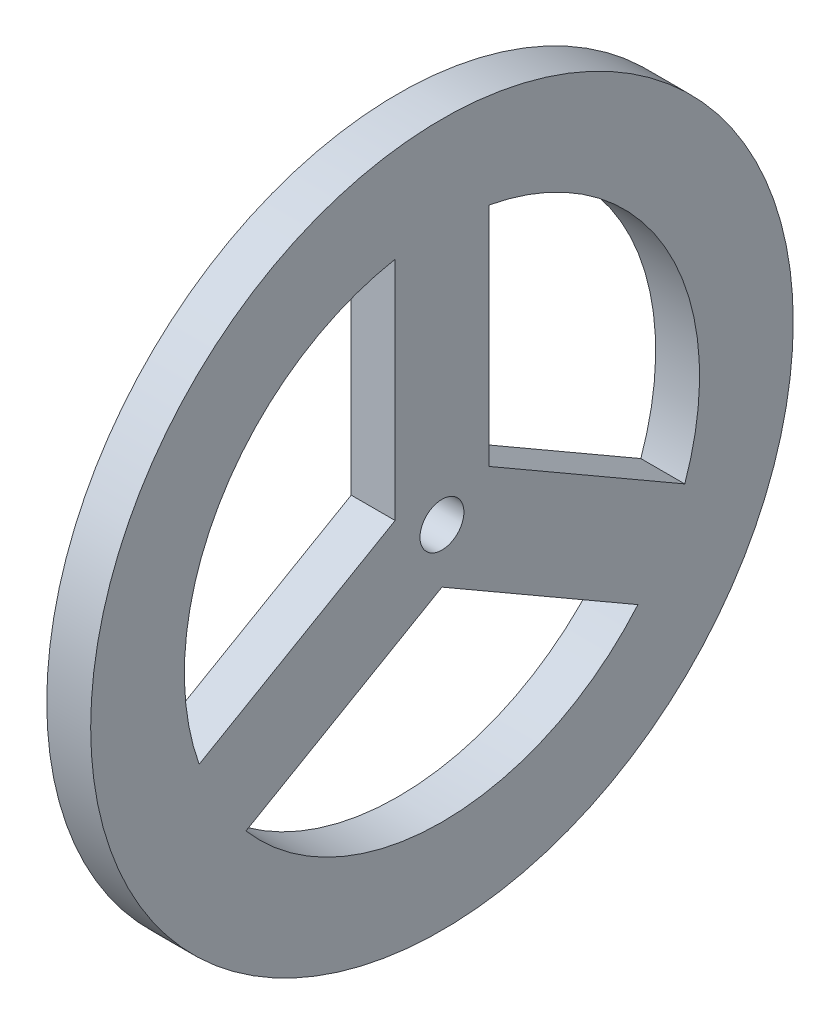
ISO-10303-21;
HEADER;
FILE_DESCRIPTION(('STEP AP214'),'2;1');
FILE_NAME('part.step','',(''),(''),'','','');
FILE_SCHEMA(('AUTOMOTIVE_DESIGN { 1 0 10303 214 1 1 1 1 }'));
ENDSEC;
DATA;
#1=APPLICATION_CONTEXT('core data for automotive mechanical design processes');
#2=APPLICATION_PROTOCOL_DEFINITION('international standard','automotive_design',2000,#1);
#3=PRODUCT_CONTEXT('',#1,'mechanical');
#4=PRODUCT('Part','Part','',(#3));
#5=PRODUCT_RELATED_PRODUCT_CATEGORY('part','',(#4));
#6=PRODUCT_DEFINITION_FORMATION('','',#4);
#7=PRODUCT_DEFINITION_CONTEXT('part definition',#1,'design');
#8=PRODUCT_DEFINITION('design','',#6,#7);
#9=PRODUCT_DEFINITION_SHAPE('','',#8);
#10=(LENGTH_UNIT() NAMED_UNIT(*) SI_UNIT(.MILLI.,.METRE.));
#11=(NAMED_UNIT(*) PLANE_ANGLE_UNIT() SI_UNIT($,.RADIAN.));
#12=(NAMED_UNIT(*) SI_UNIT($,.STERADIAN.) SOLID_ANGLE_UNIT());
#13=UNCERTAINTY_MEASURE_WITH_UNIT(LENGTH_MEASURE(1.E-05),#10,'distance_accuracy_value','');
#14=(GEOMETRIC_REPRESENTATION_CONTEXT(3) GLOBAL_UNCERTAINTY_ASSIGNED_CONTEXT((#13)) GLOBAL_UNIT_ASSIGNED_CONTEXT((#10,
#11,#12)) REPRESENTATION_CONTEXT('',''));
#15=CARTESIAN_POINT('',(0.,0.,0.));
#16=DIRECTION('',(0.,0.,1.));
#17=DIRECTION('',(1.,0.,0.));
#18=AXIS2_PLACEMENT_3D('',#15,#16,#17);
#19=CARTESIAN_POINT('',(4.7625,0.,0.));
#20=DIRECTION('',(1.,0.,0.));
#21=DIRECTION('',(0.,0.,-1.));
#22=AXIS2_PLACEMENT_3D('',#19,#20,#21);
#23=PLANE('',#22);
#24=DIRECTION('',(0.,-1.,0.));
#25=VECTOR('',#24,1.);
#26=CARTESIAN_POINT('',(4.7625,0.,5.07999999999999));
#27=LINE('',#26,#25);
#28=CARTESIAN_POINT('',(4.7625,27.4743007190356,5.08));
#29=VERTEX_POINT('',#28);
#30=CARTESIAN_POINT('',(4.7625,2.93293936748331,5.08));
#31=VERTEX_POINT('',#30);
#32=EDGE_CURVE('E153',#29,#31,#27,.T.);
#33=ORIENTED_EDGE('',*,*,#32,.T.);
#34=DIRECTION('',(0.,-0.499999999999998,0.86602540378444));
#35=VECTOR('',#34,1.);
#36=CARTESIAN_POINT('',(4.7625,4.39940905122495,2.53999999999999));
#37=LINE('',#36,#35);
#38=CARTESIAN_POINT('',(4.7625,-9.3377413082928,26.3334423738979));
#39=VERTEX_POINT('',#38);
#40=EDGE_CURVE('E161',#31,#39,#37,.T.);
#41=ORIENTED_EDGE('',*,*,#40,.T.);
#42=CARTESIAN_POINT('',(4.7625,0.,0.));
#43=DIRECTION('',(1.,0.,0.));
#44=DIRECTION('',(0.,0.,-1.));
#45=AXIS2_PLACEMENT_3D('',#42,#43,#44);
#46=CIRCLE('',#45,27.94);
#47=EDGE_CURVE('E144',#29,#39,#46,.T.);
#48=ORIENTED_EDGE('',*,*,#47,.F.);
#49=EDGE_LOOP('',(#33,#41,#48));
#50=FACE_BOUND('',#49,.T.);
#51=CARTESIAN_POINT('',(4.7625,0.,0.));
#52=DIRECTION('',(1.,0.,0.));
#53=DIRECTION('',(0.,0.,-1.));
#54=AXIS2_PLACEMENT_3D('',#51,#52,#53);
#55=CIRCLE('',#54,27.94);
#56=CARTESIAN_POINT('',(4.7625,-18.1365594107427,21.2534423738979));
#57=VERTEX_POINT('',#56);
#58=CARTESIAN_POINT('',(4.7625,-18.1365594107427,-21.2534423738979));
#59=VERTEX_POINT('',#58);
#60=EDGE_CURVE('E197',#57,#59,#55,.T.);
#61=ORIENTED_EDGE('',*,*,#60,.F.);
#62=DIRECTION('',(0.,-0.499999999999998,0.86602540378444));
#63=VECTOR('',#62,1.);
#64=CARTESIAN_POINT('',(4.7625,-4.39940905122495,-2.53999999999999));
#65=LINE('',#64,#63);
#66=CARTESIAN_POINT('',(4.7625,-5.86587873496659,0.));
#67=VERTEX_POINT('',#66);
#68=EDGE_CURVE('E195',#67,#57,#65,.T.);
#69=ORIENTED_EDGE('',*,*,#68,.F.);
#70=DIRECTION('',(0.,-0.499999999999998,-0.86602540378444));
#71=VECTOR('',#70,1.);
#72=CARTESIAN_POINT('',(4.7625,-4.39940905122496,2.53999999999999));
#73=LINE('',#72,#71);
#74=EDGE_CURVE('E201',#67,#59,#73,.T.);
#75=ORIENTED_EDGE('',*,*,#74,.T.);
#76=EDGE_LOOP('',(#61,#69,#75));
#77=FACE_BOUND('',#76,.T.);
#78=CARTESIAN_POINT('',(4.7625,0.,0.));
#79=DIRECTION('',(1.,0.,0.));
#80=DIRECTION('',(0.,0.,-1.));
#81=AXIS2_PLACEMENT_3D('',#78,#79,#80);
#82=CIRCLE('',#81,38.1);
#83=CARTESIAN_POINT('',(4.7625,0.,38.1));
#84=VERTEX_POINT('',#83);
#85=EDGE_CURVE('E12',#84,#84,#82,.T.);
#86=ORIENTED_EDGE('',*,*,#85,.T.);
#87=EDGE_LOOP('',(#86));
#88=FACE_BOUND('',#87,.T.);
#89=CARTESIAN_POINT('',(4.7625,0.,0.));
#90=DIRECTION('',(1.,0.,0.));
#91=DIRECTION('',(0.,0.,-1.));
#92=AXIS2_PLACEMENT_3D('',#89,#90,#91);
#93=CIRCLE('',#92,2.38125);
#94=CARTESIAN_POINT('',(4.7625,0.,2.38125));
#95=VERTEX_POINT('',#94);
#96=EDGE_CURVE('E185',#95,#95,#93,.T.);
#97=ORIENTED_EDGE('',*,*,#96,.F.);
#98=EDGE_LOOP('',(#97));
#99=FACE_BOUND('',#98,.T.);
#100=CARTESIAN_POINT('',(4.7625,0.,0.));
#101=DIRECTION('',(1.,0.,0.));
#102=DIRECTION('',(0.,0.,-1.));
#103=AXIS2_PLACEMENT_3D('',#100,#101,#102);
#104=CIRCLE('',#103,27.94);
#105=CARTESIAN_POINT('',(4.7625,-9.33774130829278,-26.3334423738979));
#106=VERTEX_POINT('',#105);
#107=CARTESIAN_POINT('',(4.7625,27.4743007190356,-5.08));
#108=VERTEX_POINT('',#107);
#109=EDGE_CURVE('E175',#106,#108,#104,.T.);
#110=ORIENTED_EDGE('',*,*,#109,.F.);
#111=DIRECTION('',(0.,-0.499999999999998,-0.86602540378444));
#112=VECTOR('',#111,1.);
#113=CARTESIAN_POINT('',(4.7625,4.39940905122496,-2.53999999999999));
#114=LINE('',#113,#112);
#115=CARTESIAN_POINT('',(4.7625,2.93293936748331,-5.08));
#116=VERTEX_POINT('',#115);
#117=EDGE_CURVE('E173',#116,#106,#114,.T.);
#118=ORIENTED_EDGE('',*,*,#117,.F.);
#119=DIRECTION('',(0.,-1.,0.));
#120=VECTOR('',#119,1.);
#121=CARTESIAN_POINT('',(4.7625,0.,-5.08000000000001));
#122=LINE('',#121,#120);
#123=EDGE_CURVE('E178',#108,#116,#122,.T.);
#124=ORIENTED_EDGE('',*,*,#123,.F.);
#125=EDGE_LOOP('',(#110,#118,#124));
#126=FACE_BOUND('',#125,.T.);
#127=ADVANCED_FACE('F69',(#50,#77,#88,#99,#126),#23,.T.);
#128=CARTESIAN_POINT('',(0.,0.,0.));
#129=DIRECTION('',(1.,0.,0.));
#130=DIRECTION('',(0.,0.,-1.));
#131=AXIS2_PLACEMENT_3D('',#128,#129,#130);
#132=PLANE('',#131);
#133=DIRECTION('',(0.,-0.499999999999998,0.86602540378444));
#134=VECTOR('',#133,1.);
#135=CARTESIAN_POINT('',(0.,4.39940905122495,2.53999999999999));
#136=LINE('',#135,#134);
#137=CARTESIAN_POINT('',(0.,2.93293936748331,5.08));
#138=VERTEX_POINT('',#137);
#139=CARTESIAN_POINT('',(0.,-9.3377413082928,26.3334423738979));
#140=VERTEX_POINT('',#139);
#141=EDGE_CURVE('E158',#138,#140,#136,.T.);
#142=ORIENTED_EDGE('',*,*,#141,.F.);
#143=DIRECTION('',(0.,-1.,0.));
#144=VECTOR('',#143,1.);
#145=CARTESIAN_POINT('',(0.,0.,5.07999999999999));
#146=LINE('',#145,#144);
#147=CARTESIAN_POINT('',(0.,27.4743007190356,5.08));
#148=VERTEX_POINT('',#147);
#149=EDGE_CURVE('E166',#148,#138,#146,.T.);
#150=ORIENTED_EDGE('',*,*,#149,.F.);
#151=CARTESIAN_POINT('',(0.,0.,0.));
#152=DIRECTION('',(1.,0.,0.));
#153=DIRECTION('',(0.,0.,-1.));
#154=AXIS2_PLACEMENT_3D('',#151,#152,#153);
#155=CIRCLE('',#154,27.94);
#156=EDGE_CURVE('E147',#148,#140,#155,.T.);
#157=ORIENTED_EDGE('',*,*,#156,.T.);
#158=EDGE_LOOP('',(#142,#150,#157));
#159=FACE_BOUND('',#158,.T.);
#160=CARTESIAN_POINT('',(0.,0.,0.));
#161=DIRECTION('',(1.,0.,0.));
#162=DIRECTION('',(0.,0.,-1.));
#163=AXIS2_PLACEMENT_3D('',#160,#161,#162);
#164=CIRCLE('',#163,2.38125);
#165=CARTESIAN_POINT('',(0.,0.,2.38125));
#166=VERTEX_POINT('',#165);
#167=EDGE_CURVE('E278',#166,#166,#164,.T.);
#168=ORIENTED_EDGE('',*,*,#167,.T.);
#169=EDGE_LOOP('',(#168));
#170=FACE_BOUND('',#169,.T.);
#171=DIRECTION('',(0.,-0.499999999999998,0.86602540378444));
#172=VECTOR('',#171,1.);
#173=CARTESIAN_POINT('',(0.,-4.39940905122495,-2.53999999999999));
#174=LINE('',#173,#172);
#175=CARTESIAN_POINT('',(0.,-5.86587873496659,0.));
#176=VERTEX_POINT('',#175);
#177=CARTESIAN_POINT('',(0.,-18.1365594107427,21.2534423738979));
#178=VERTEX_POINT('',#177);
#179=EDGE_CURVE('E150',#176,#178,#174,.T.);
#180=ORIENTED_EDGE('',*,*,#179,.T.);
#181=CARTESIAN_POINT('',(0.,0.,0.));
#182=DIRECTION('',(1.,0.,0.));
#183=DIRECTION('',(0.,0.,-1.));
#184=AXIS2_PLACEMENT_3D('',#181,#182,#183);
#185=CIRCLE('',#184,27.94);
#186=CARTESIAN_POINT('',(0.,-18.1365594107427,-21.2534423738979));
#187=VERTEX_POINT('',#186);
#188=EDGE_CURVE('E207',#178,#187,#185,.T.);
#189=ORIENTED_EDGE('',*,*,#188,.T.);
#190=DIRECTION('',(0.,-0.499999999999998,-0.86602540378444));
#191=VECTOR('',#190,1.);
#192=CARTESIAN_POINT('',(0.,-4.39940905122496,2.53999999999999));
#193=LINE('',#192,#191);
#194=EDGE_CURVE('E198',#176,#187,#193,.T.);
#195=ORIENTED_EDGE('',*,*,#194,.F.);
#196=EDGE_LOOP('',(#180,#189,#195));
#197=FACE_BOUND('',#196,.T.);
#198=CARTESIAN_POINT('',(0.,0.,0.));
#199=DIRECTION('',(1.,0.,0.));
#200=DIRECTION('',(0.,0.,-1.));
#201=AXIS2_PLACEMENT_3D('',#198,#199,#200);
#202=CIRCLE('',#201,38.1);
#203=CARTESIAN_POINT('',(0.,0.,38.1));
#204=VERTEX_POINT('',#203);
#205=EDGE_CURVE('E73',#204,#204,#202,.T.);
#206=ORIENTED_EDGE('',*,*,#205,.F.);
#207=EDGE_LOOP('',(#206));
#208=FACE_BOUND('',#207,.T.);
#209=DIRECTION('',(0.,-0.499999999999998,-0.86602540378444));
#210=VECTOR('',#209,1.);
#211=CARTESIAN_POINT('',(0.,4.39940905122496,-2.53999999999999));
#212=LINE('',#211,#210);
#213=CARTESIAN_POINT('',(0.,2.93293936748331,-5.08000000000001));
#214=VERTEX_POINT('',#213);
#215=CARTESIAN_POINT('',(0.,-9.33774130829278,-26.3334423738979));
#216=VERTEX_POINT('',#215);
#217=EDGE_CURVE('E181',#214,#216,#212,.T.);
#218=ORIENTED_EDGE('',*,*,#217,.T.);
#219=CARTESIAN_POINT('',(0.,0.,0.));
#220=DIRECTION('',(1.,0.,0.));
#221=DIRECTION('',(0.,0.,-1.));
#222=AXIS2_PLACEMENT_3D('',#219,#220,#221);
#223=CIRCLE('',#222,27.94);
#224=CARTESIAN_POINT('',(0.,27.4743007190356,-5.08));
#225=VERTEX_POINT('',#224);
#226=EDGE_CURVE('E184',#216,#225,#223,.T.);
#227=ORIENTED_EDGE('',*,*,#226,.T.);
#228=DIRECTION('',(0.,-1.,0.));
#229=VECTOR('',#228,1.);
#230=CARTESIAN_POINT('',(0.,0.,-5.08000000000001));
#231=LINE('',#230,#229);
#232=EDGE_CURVE('E176',#225,#214,#231,.T.);
#233=ORIENTED_EDGE('',*,*,#232,.T.);
#234=EDGE_LOOP('',(#218,#227,#233));
#235=FACE_BOUND('',#234,.T.);
#236=ADVANCED_FACE('F224',(#159,#170,#197,#208,#235),#132,.F.);
#237=CARTESIAN_POINT('',(4.7625,0.,0.));
#238=DIRECTION('',(-1.,0.,0.));
#239=DIRECTION('',(0.,0.,1.));
#240=AXIS2_PLACEMENT_3D('',#237,#238,#239);
#241=CYLINDRICAL_SURFACE('',#240,38.1);
#242=CARTESIAN_POINT('',(4.7625,0.,38.1));
#243=CARTESIAN_POINT('',(4.712890625,0.,38.1));
#244=CARTESIAN_POINT('',(4.66328125,0.,38.1));
#245=CARTESIAN_POINT('',(4.5640625,0.,38.1));
#246=CARTESIAN_POINT('',(4.514453125,0.,38.1));
#247=CARTESIAN_POINT('',(4.415234375,0.,38.1));
#248=CARTESIAN_POINT('',(4.365625,0.,38.1));
#249=CARTESIAN_POINT('',(4.26640625,0.,38.1));
#250=CARTESIAN_POINT('',(4.216796875,0.,38.1));
#251=CARTESIAN_POINT('',(4.117578125,0.,38.1));
#252=CARTESIAN_POINT('',(4.06796875,0.,38.1));
#253=CARTESIAN_POINT('',(3.96875,0.,38.1));
#254=CARTESIAN_POINT('',(3.919140625,0.,38.1));
#255=CARTESIAN_POINT('',(3.819921875,0.,38.1));
#256=CARTESIAN_POINT('',(3.7703125,0.,38.1));
#257=CARTESIAN_POINT('',(3.67109375,0.,38.1));
#258=CARTESIAN_POINT('',(3.621484375,0.,38.1));
#259=CARTESIAN_POINT('',(3.522265625,0.,38.1));
#260=CARTESIAN_POINT('',(3.47265625,0.,38.1));
#261=CARTESIAN_POINT('',(3.3734375,0.,38.1));
#262=CARTESIAN_POINT('',(3.323828125,0.,38.1));
#263=CARTESIAN_POINT('',(3.224609375,0.,38.1));
#264=CARTESIAN_POINT('',(3.175,0.,38.1));
#265=CARTESIAN_POINT('',(3.07578125,0.,38.1));
#266=CARTESIAN_POINT('',(3.026171875,0.,38.1));
#267=CARTESIAN_POINT('',(2.926953125,0.,38.1));
#268=CARTESIAN_POINT('',(2.87734375,0.,38.1));
#269=CARTESIAN_POINT('',(2.778125,0.,38.1));
#270=CARTESIAN_POINT('',(2.728515625,0.,38.1));
#271=CARTESIAN_POINT('',(2.629296875,0.,38.1));
#272=CARTESIAN_POINT('',(2.5796875,0.,38.1));
#273=CARTESIAN_POINT('',(2.48046875,0.,38.1));
#274=CARTESIAN_POINT('',(2.430859375,0.,38.1));
#275=CARTESIAN_POINT('',(2.331640625,0.,38.1));
#276=CARTESIAN_POINT('',(2.28203125,0.,38.1));
#277=CARTESIAN_POINT('',(2.1828125,0.,38.1));
#278=CARTESIAN_POINT('',(2.133203125,0.,38.1));
#279=CARTESIAN_POINT('',(2.033984375,0.,38.1));
#280=CARTESIAN_POINT('',(1.984375,0.,38.1));
#281=CARTESIAN_POINT('',(1.88515625,0.,38.1));
#282=CARTESIAN_POINT('',(1.835546875,0.,38.1));
#283=CARTESIAN_POINT('',(1.736328125,0.,38.1));
#284=CARTESIAN_POINT('',(1.68671875,0.,38.1));
#285=CARTESIAN_POINT('',(1.5875,0.,38.1));
#286=CARTESIAN_POINT('',(1.537890625,0.,38.1));
#287=CARTESIAN_POINT('',(1.438671875,0.,38.1));
#288=CARTESIAN_POINT('',(1.3890625,0.,38.1));
#289=CARTESIAN_POINT('',(1.28984375,0.,38.1));
#290=CARTESIAN_POINT('',(1.240234375,0.,38.1));
#291=CARTESIAN_POINT('',(1.141015625,0.,38.1));
#292=CARTESIAN_POINT('',(1.09140625,0.,38.1));
#293=CARTESIAN_POINT('',(0.992187499999999,0.,38.1));
#294=CARTESIAN_POINT('',(0.942578124999999,0.,38.1));
#295=CARTESIAN_POINT('',(0.843359375,0.,38.1));
#296=CARTESIAN_POINT('',(0.79375,0.,38.1));
#297=CARTESIAN_POINT('',(0.69453125,0.,38.1));
#298=CARTESIAN_POINT('',(0.644921875,0.,38.1));
#299=CARTESIAN_POINT('',(0.545703125,0.,38.1));
#300=CARTESIAN_POINT('',(0.49609375,0.,38.1));
#301=CARTESIAN_POINT('',(0.396875,0.,38.1));
#302=CARTESIAN_POINT('',(0.347265625,0.,38.1));
#303=CARTESIAN_POINT('',(0.248046875,0.,38.1));
#304=CARTESIAN_POINT('',(0.1984375,0.,38.1));
#305=CARTESIAN_POINT('',(0.09921875,0.,38.1));
#306=CARTESIAN_POINT('',(0.049609375,0.,38.1));
#307=CARTESIAN_POINT('',(0.,0.,38.1));
#308=B_SPLINE_CURVE_WITH_KNOTS('',3,(#242,#243,#244,#245,#246,#247,#248,#249,#250,#251,#252,
#253,#254,#255,#256,#257,#258,#259,#260,#261,#262,#263,#264,#265,#266,#267,#268,#269,#270,#271,
#272,#273,#274,#275,#276,#277,#278,#279,#280,#281,#282,#283,#284,#285,#286,#287,#288,#289,#290,
#291,#292,#293,#294,#295,#296,#297,#298,#299,#300,#301,#302,#303,#304,#305,#306,#307),
.UNSPECIFIED.,.F.,.F.,(4,2,2,2,2,2,2,2,2,2,2,2,2,2,2,2,2,2,2,2,2,2,2,2,2,2,2,2,2,2,2,2,4),(0.,
0.148828125,0.29765625,0.446484375,0.5953125,0.744140625,0.892968750000001,1.041796875,1.190625,
1.339453125,1.48828125,1.637109375,1.7859375,1.934765625,2.08359375,2.232421875,2.38125,
2.530078125,2.67890625,2.827734375,2.9765625,3.125390625,3.27421875,3.423046875,3.571875,
3.720703125,3.86953125,4.018359375,4.1671875,4.316015625,4.46484375,4.613671875,4.7625),.UNSPECIFIED.);
#309=EDGE_CURVE('BSEAM71',#84,#204,#308,.T.);
#310=ORIENTED_EDGE('',*,*,#85,.F.);
#311=ORIENTED_EDGE('',*,*,#205,.T.);
#312=ORIENTED_EDGE('',*,*,#309,.T.);
#313=ORIENTED_EDGE('',*,*,#309,.F.);
#314=EDGE_LOOP('',(#310,#312,#311,#313));
#315=FACE_BOUND('',#314,.T.);
#316=ADVANCED_FACE('F71',(#315),#241,.T.);
#317=CARTESIAN_POINT('',(4.7625,-4.39940905122495,-2.53999999999999));
#318=DIRECTION('',(0.,-0.86602540378444,-0.499999999999998));
#319=DIRECTION('',(0.,0.499999999999998,-0.86602540378444));
#320=AXIS2_PLACEMENT_3D('',#317,#318,#319);
#321=PLANE('',#320);
#322=ORIENTED_EDGE('',*,*,#179,.F.);
#323=DIRECTION('',(-1.,0.,0.));
#324=VECTOR('',#323,1.);
#325=CARTESIAN_POINT('',(4.7625,-5.86587873496659,0.));
#326=LINE('',#325,#324);
#327=EDGE_CURVE('E204',#67,#176,#326,.T.);
#328=ORIENTED_EDGE('',*,*,#327,.F.);
#329=ORIENTED_EDGE('',*,*,#68,.T.);
#330=DIRECTION('',(-1.,0.,0.));
#331=VECTOR('',#330,1.);
#332=CARTESIAN_POINT('',(4.7625,-18.1365594107427,21.2534423738979));
#333=LINE('',#332,#331);
#334=EDGE_CURVE('E216',#57,#178,#333,.T.);
#335=ORIENTED_EDGE('',*,*,#334,.T.);
#336=EDGE_LOOP('',(#322,#328,#329,#335));
#337=FACE_BOUND('',#336,.T.);
#338=ADVANCED_FACE('F253',(#337),#321,.T.);
#339=CARTESIAN_POINT('',(4.7625,0.,0.));
#340=DIRECTION('',(-1.,0.,0.));
#341=DIRECTION('',(0.,0.,1.));
#342=AXIS2_PLACEMENT_3D('',#339,#340,#341);
#343=CYLINDRICAL_SURFACE('',#342,27.94);
#344=ORIENTED_EDGE('',*,*,#188,.F.);
#345=ORIENTED_EDGE('',*,*,#334,.F.);
#346=ORIENTED_EDGE('',*,*,#60,.T.);
#347=DIRECTION('',(-1.,0.,0.));
#348=VECTOR('',#347,1.);
#349=CARTESIAN_POINT('',(4.7625,-18.1365594107427,-21.2534423738979));
#350=LINE('',#349,#348);
#351=EDGE_CURVE('E214',#59,#187,#350,.T.);
#352=ORIENTED_EDGE('',*,*,#351,.T.);
#353=EDGE_LOOP('',(#344,#345,#346,#352));
#354=FACE_BOUND('',#353,.T.);
#355=ADVANCED_FACE('F256',(#354),#343,.F.);
#356=CARTESIAN_POINT('',(4.7625,-4.39940905122496,2.53999999999999));
#357=DIRECTION('',(0.,0.86602540378444,-0.499999999999998));
#358=DIRECTION('',(0.,0.499999999999998,0.86602540378444));
#359=AXIS2_PLACEMENT_3D('',#356,#357,#358);
#360=PLANE('',#359);
#361=ORIENTED_EDGE('',*,*,#194,.T.);
#362=ORIENTED_EDGE('',*,*,#351,.F.);
#363=ORIENTED_EDGE('',*,*,#74,.F.);
#364=ORIENTED_EDGE('',*,*,#327,.T.);
#365=EDGE_LOOP('',(#361,#362,#363,#364));
#366=FACE_BOUND('',#365,.T.);
#367=ADVANCED_FACE('F259',(#366),#360,.F.);
#368=CARTESIAN_POINT('',(4.7625,0.,0.));
#369=DIRECTION('',(-1.,0.,0.));
#370=DIRECTION('',(0.,0.,1.));
#371=AXIS2_PLACEMENT_3D('',#368,#369,#370);
#372=CYLINDRICAL_SURFACE('',#371,2.38125);
#373=CARTESIAN_POINT('',(4.7625,0.,2.38125));
#374=CARTESIAN_POINT('',(4.712890625,0.,2.38125));
#375=CARTESIAN_POINT('',(4.66328125,0.,2.38125));
#376=CARTESIAN_POINT('',(4.5640625,0.,2.38125));
#377=CARTESIAN_POINT('',(4.514453125,0.,2.38125));
#378=CARTESIAN_POINT('',(4.415234375,0.,2.38125));
#379=CARTESIAN_POINT('',(4.365625,0.,2.38125));
#380=CARTESIAN_POINT('',(4.26640625,0.,2.38125));
#381=CARTESIAN_POINT('',(4.216796875,0.,2.38125));
#382=CARTESIAN_POINT('',(4.117578125,0.,2.38125));
#383=CARTESIAN_POINT('',(4.06796875,0.,2.38125));
#384=CARTESIAN_POINT('',(3.96875,0.,2.38125));
#385=CARTESIAN_POINT('',(3.919140625,0.,2.38125));
#386=CARTESIAN_POINT('',(3.819921875,0.,2.38125));
#387=CARTESIAN_POINT('',(3.7703125,0.,2.38125));
#388=CARTESIAN_POINT('',(3.67109375,0.,2.38125));
#389=CARTESIAN_POINT('',(3.621484375,0.,2.38125));
#390=CARTESIAN_POINT('',(3.522265625,0.,2.38125));
#391=CARTESIAN_POINT('',(3.47265625,0.,2.38125));
#392=CARTESIAN_POINT('',(3.3734375,0.,2.38125));
#393=CARTESIAN_POINT('',(3.323828125,0.,2.38125));
#394=CARTESIAN_POINT('',(3.224609375,0.,2.38125));
#395=CARTESIAN_POINT('',(3.175,0.,2.38125));
#396=CARTESIAN_POINT('',(3.07578125,0.,2.38125));
#397=CARTESIAN_POINT('',(3.026171875,0.,2.38125));
#398=CARTESIAN_POINT('',(2.926953125,0.,2.38125));
#399=CARTESIAN_POINT('',(2.87734375,0.,2.38125));
#400=CARTESIAN_POINT('',(2.778125,0.,2.38125));
#401=CARTESIAN_POINT('',(2.728515625,0.,2.38125));
#402=CARTESIAN_POINT('',(2.629296875,0.,2.38125));
#403=CARTESIAN_POINT('',(2.5796875,0.,2.38125));
#404=CARTESIAN_POINT('',(2.48046875,0.,2.38125));
#405=CARTESIAN_POINT('',(2.430859375,0.,2.38125));
#406=CARTESIAN_POINT('',(2.331640625,0.,2.38125));
#407=CARTESIAN_POINT('',(2.28203125,0.,2.38125));
#408=CARTESIAN_POINT('',(2.1828125,0.,2.38125));
#409=CARTESIAN_POINT('',(2.133203125,0.,2.38125));
#410=CARTESIAN_POINT('',(2.033984375,0.,2.38125));
#411=CARTESIAN_POINT('',(1.984375,0.,2.38125));
#412=CARTESIAN_POINT('',(1.88515625,0.,2.38125));
#413=CARTESIAN_POINT('',(1.835546875,0.,2.38125));
#414=CARTESIAN_POINT('',(1.736328125,0.,2.38125));
#415=CARTESIAN_POINT('',(1.68671875,0.,2.38125));
#416=CARTESIAN_POINT('',(1.5875,0.,2.38125));
#417=CARTESIAN_POINT('',(1.537890625,0.,2.38125));
#418=CARTESIAN_POINT('',(1.438671875,0.,2.38125));
#419=CARTESIAN_POINT('',(1.3890625,0.,2.38125));
#420=CARTESIAN_POINT('',(1.28984375,0.,2.38125));
#421=CARTESIAN_POINT('',(1.240234375,0.,2.38125));
#422=CARTESIAN_POINT('',(1.141015625,0.,2.38125));
#423=CARTESIAN_POINT('',(1.09140625,0.,2.38125));
#424=CARTESIAN_POINT('',(0.992187499999999,0.,2.38125));
#425=CARTESIAN_POINT('',(0.942578124999999,0.,2.38125));
#426=CARTESIAN_POINT('',(0.843359375,0.,2.38125));
#427=CARTESIAN_POINT('',(0.79375,0.,2.38125));
#428=CARTESIAN_POINT('',(0.69453125,0.,2.38125));
#429=CARTESIAN_POINT('',(0.644921875,0.,2.38125));
#430=CARTESIAN_POINT('',(0.545703125,0.,2.38125));
#431=CARTESIAN_POINT('',(0.49609375,0.,2.38125));
#432=CARTESIAN_POINT('',(0.396875,0.,2.38125));
#433=CARTESIAN_POINT('',(0.347265625,0.,2.38125));
#434=CARTESIAN_POINT('',(0.248046875,0.,2.38125));
#435=CARTESIAN_POINT('',(0.1984375,0.,2.38125));
#436=CARTESIAN_POINT('',(0.09921875,0.,2.38125));
#437=CARTESIAN_POINT('',(0.049609375,0.,2.38125));
#438=CARTESIAN_POINT('',(0.,0.,2.38125));
#439=B_SPLINE_CURVE_WITH_KNOTS('',3,(#373,#374,#375,#376,#377,#378,#379,#380,#381,#382,#383,
#384,#385,#386,#387,#388,#389,#390,#391,#392,#393,#394,#395,#396,#397,#398,#399,#400,#401,#402,
#403,#404,#405,#406,#407,#408,#409,#410,#411,#412,#413,#414,#415,#416,#417,#418,#419,#420,#421,
#422,#423,#424,#425,#426,#427,#428,#429,#430,#431,#432,#433,#434,#435,#436,#437,#438),
.UNSPECIFIED.,.F.,.F.,(4,2,2,2,2,2,2,2,2,2,2,2,2,2,2,2,2,2,2,2,2,2,2,2,2,2,2,2,2,2,2,2,4),(0.,
0.148828125,0.29765625,0.446484375,0.5953125,0.744140625,0.892968750000001,1.041796875,1.190625,
1.339453125,1.48828125,1.637109375,1.7859375,1.934765625,2.08359375,2.232421875,2.38125,
2.530078125,2.67890625,2.827734375,2.9765625,3.125390625,3.27421875,3.423046875,3.571875,
3.720703125,3.86953125,4.018359375,4.1671875,4.316015625,4.46484375,4.613671875,4.7625),.UNSPECIFIED.);
#440=EDGE_CURVE('BSEAM246',#95,#166,#439,.T.);
#441=ORIENTED_EDGE('',*,*,#96,.T.);
#442=ORIENTED_EDGE('',*,*,#167,.F.);
#443=ORIENTED_EDGE('',*,*,#440,.T.);
#444=ORIENTED_EDGE('',*,*,#440,.F.);
#445=EDGE_LOOP('',(#441,#443,#442,#444));
#446=FACE_BOUND('',#445,.T.);
#447=ADVANCED_FACE('F246',(#446),#372,.F.);
#448=CARTESIAN_POINT('',(4.7625,4.39940905122496,-2.53999999999999));
#449=DIRECTION('',(0.,0.86602540378444,-0.499999999999998));
#450=DIRECTION('',(0.,0.499999999999998,0.86602540378444));
#451=AXIS2_PLACEMENT_3D('',#448,#449,#450);
#452=PLANE('',#451);
#453=ORIENTED_EDGE('',*,*,#217,.F.);
#454=DIRECTION('',(-1.,0.,0.));
#455=VECTOR('',#454,1.);
#456=CARTESIAN_POINT('',(4.7625,2.93293936748331,-5.08));
#457=LINE('',#456,#455);
#458=EDGE_CURVE('E180',#116,#214,#457,.T.);
#459=ORIENTED_EDGE('',*,*,#458,.F.);
#460=ORIENTED_EDGE('',*,*,#117,.T.);
#461=DIRECTION('',(-1.,0.,0.));
#462=VECTOR('',#461,1.);
#463=CARTESIAN_POINT('',(4.7625,-9.33774130829278,-26.3334423738979));
#464=LINE('',#463,#462);
#465=EDGE_CURVE('E168',#106,#216,#464,.T.);
#466=ORIENTED_EDGE('',*,*,#465,.T.);
#467=EDGE_LOOP('',(#453,#459,#460,#466));
#468=FACE_BOUND('',#467,.T.);
#469=ADVANCED_FACE('F230',(#468),#452,.T.);
#470=CARTESIAN_POINT('',(4.7625,0.,0.));
#471=DIRECTION('',(-1.,0.,0.));
#472=DIRECTION('',(0.,0.,1.));
#473=AXIS2_PLACEMENT_3D('',#470,#471,#472);
#474=CYLINDRICAL_SURFACE('',#473,27.94);
#475=ORIENTED_EDGE('',*,*,#226,.F.);
#476=ORIENTED_EDGE('',*,*,#465,.F.);
#477=ORIENTED_EDGE('',*,*,#109,.T.);
#478=DIRECTION('',(-1.,0.,0.));
#479=VECTOR('',#478,1.);
#480=CARTESIAN_POINT('',(4.7625,27.4743007190356,-5.08));
#481=LINE('',#480,#479);
#482=EDGE_CURVE('E92',#108,#225,#481,.T.);
#483=ORIENTED_EDGE('',*,*,#482,.T.);
#484=EDGE_LOOP('',(#475,#476,#477,#483));
#485=FACE_BOUND('',#484,.T.);
#486=ADVANCED_FACE('F238',(#485),#474,.F.);
#487=CARTESIAN_POINT('',(4.7625,0.,-5.08000000000001));
#488=DIRECTION('',(0.,0.,-1.));
#489=DIRECTION('',(0.,1.,0.));
#490=AXIS2_PLACEMENT_3D('',#487,#488,#489);
#491=PLANE('',#490);
#492=ORIENTED_EDGE('',*,*,#232,.F.);
#493=ORIENTED_EDGE('',*,*,#482,.F.);
#494=ORIENTED_EDGE('',*,*,#123,.T.);
#495=ORIENTED_EDGE('',*,*,#458,.T.);
#496=EDGE_LOOP('',(#492,#493,#494,#495));
#497=FACE_BOUND('',#496,.T.);
#498=ADVANCED_FACE('F233',(#497),#491,.T.);
#499=CARTESIAN_POINT('',(4.7625,0.,5.07999999999999));
#500=DIRECTION('',(0.,0.,-1.));
#501=DIRECTION('',(0.,1.,0.));
#502=AXIS2_PLACEMENT_3D('',#499,#500,#501);
#503=PLANE('',#502);
#504=ORIENTED_EDGE('',*,*,#149,.T.);
#505=DIRECTION('',(-1.,0.,0.));
#506=VECTOR('',#505,1.);
#507=CARTESIAN_POINT('',(4.7625,2.93293936748331,5.08));
#508=LINE('',#507,#506);
#509=EDGE_CURVE('E156',#31,#138,#508,.T.);
#510=ORIENTED_EDGE('',*,*,#509,.F.);
#511=ORIENTED_EDGE('',*,*,#32,.F.);
#512=DIRECTION('',(-1.,0.,0.));
#513=VECTOR('',#512,1.);
#514=CARTESIAN_POINT('',(4.7625,27.4743007190356,5.08));
#515=LINE('',#514,#513);
#516=EDGE_CURVE('E140',#29,#148,#515,.T.);
#517=ORIENTED_EDGE('',*,*,#516,.T.);
#518=EDGE_LOOP('',(#504,#510,#511,#517));
#519=FACE_BOUND('',#518,.T.);
#520=ADVANCED_FACE('F154',(#519),#503,.F.);
#521=CARTESIAN_POINT('',(4.7625,0.,0.));
#522=DIRECTION('',(-1.,0.,0.));
#523=DIRECTION('',(0.,0.,1.));
#524=AXIS2_PLACEMENT_3D('',#521,#522,#523);
#525=CYLINDRICAL_SURFACE('',#524,27.94);
#526=ORIENTED_EDGE('',*,*,#156,.F.);
#527=ORIENTED_EDGE('',*,*,#516,.F.);
#528=ORIENTED_EDGE('',*,*,#47,.T.);
#529=DIRECTION('',(-1.,0.,0.));
#530=VECTOR('',#529,1.);
#531=CARTESIAN_POINT('',(4.7625,-9.3377413082928,26.3334423738979));
#532=LINE('',#531,#530);
#533=EDGE_CURVE('E84',#39,#140,#532,.T.);
#534=ORIENTED_EDGE('',*,*,#533,.T.);
#535=EDGE_LOOP('',(#526,#527,#528,#534));
#536=FACE_BOUND('',#535,.T.);
#537=ADVANCED_FACE('F142',(#536),#525,.F.);
#538=CARTESIAN_POINT('',(4.7625,4.39940905122495,2.53999999999999));
#539=DIRECTION('',(0.,-0.86602540378444,-0.499999999999998));
#540=DIRECTION('',(0.,0.499999999999998,-0.86602540378444));
#541=AXIS2_PLACEMENT_3D('',#538,#539,#540);
#542=PLANE('',#541);
#543=ORIENTED_EDGE('',*,*,#141,.T.);
#544=ORIENTED_EDGE('',*,*,#533,.F.);
#545=ORIENTED_EDGE('',*,*,#40,.F.);
#546=ORIENTED_EDGE('',*,*,#509,.T.);
#547=EDGE_LOOP('',(#543,#544,#545,#546));
#548=FACE_BOUND('',#547,.T.);
#549=ADVANCED_FACE('F341',(#548),#542,.F.);
#550=CLOSED_SHELL('',(#127,#236,#316,#338,#355,#367,#447,#469,#486,#498,#520,#537,#549));
#551=MANIFOLD_SOLID_BREP('B2',#550);
#552=ADVANCED_BREP_SHAPE_REPRESENTATION('',(#18,#551),#14);
#553=SHAPE_DEFINITION_REPRESENTATION(#9,#552);
ENDSEC;
END-ISO-10303-21;
